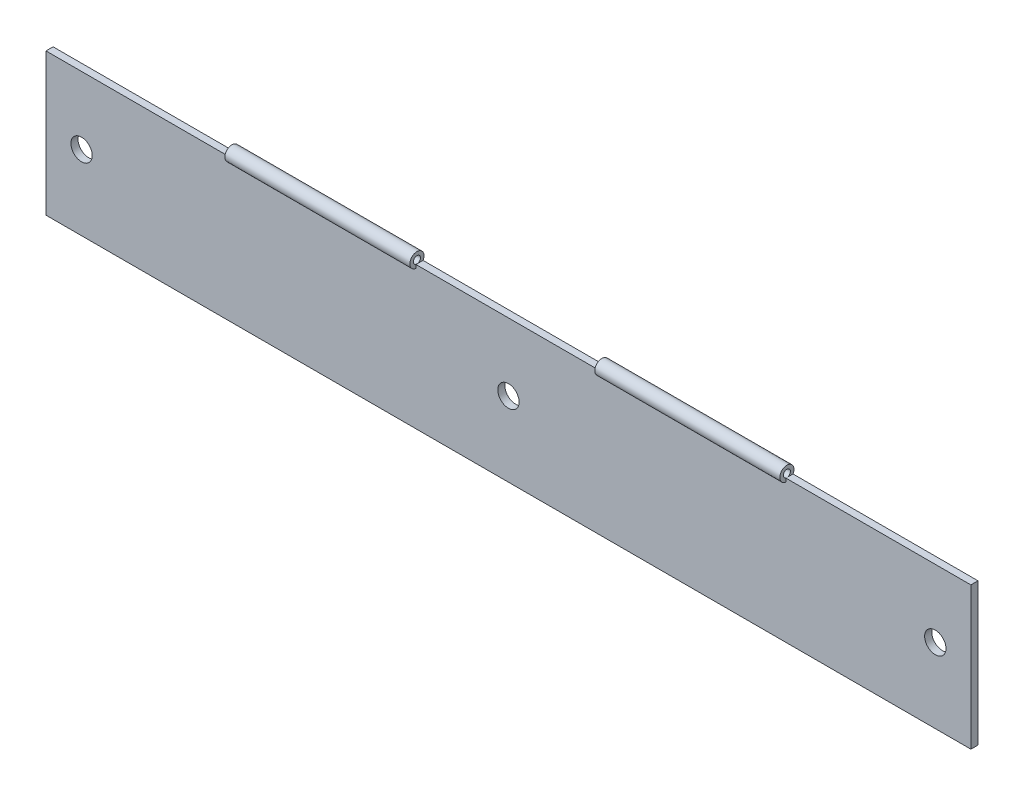
ISO-10303-21;
HEADER;
FILE_DESCRIPTION(('STEP AP214'),'2;1');
FILE_NAME('part.step','',(''),(''),'','','');
FILE_SCHEMA(('AUTOMOTIVE_DESIGN { 1 0 10303 214 1 1 1 1 }'));
ENDSEC;
DATA;
#1=APPLICATION_CONTEXT('core data for automotive mechanical design processes');
#2=APPLICATION_PROTOCOL_DEFINITION('international standard','automotive_design',2000,#1);
#3=PRODUCT_CONTEXT('',#1,'mechanical');
#4=PRODUCT('Part','Part','',(#3));
#5=PRODUCT_RELATED_PRODUCT_CATEGORY('part','',(#4));
#6=PRODUCT_DEFINITION_FORMATION('','',#4);
#7=PRODUCT_DEFINITION_CONTEXT('part definition',#1,'design');
#8=PRODUCT_DEFINITION('design','',#6,#7);
#9=PRODUCT_DEFINITION_SHAPE('','',#8);
#10=(LENGTH_UNIT() NAMED_UNIT(*) SI_UNIT(.MILLI.,.METRE.));
#11=(NAMED_UNIT(*) PLANE_ANGLE_UNIT() SI_UNIT($,.RADIAN.));
#12=(NAMED_UNIT(*) SI_UNIT($,.STERADIAN.) SOLID_ANGLE_UNIT());
#13=UNCERTAINTY_MEASURE_WITH_UNIT(LENGTH_MEASURE(1.E-05),#10,'distance_accuracy_value','');
#14=(GEOMETRIC_REPRESENTATION_CONTEXT(3) GLOBAL_UNCERTAINTY_ASSIGNED_CONTEXT((#13)) GLOBAL_UNIT_ASSIGNED_CONTEXT((#10,
#11,#12)) REPRESENTATION_CONTEXT('',''));
#15=CARTESIAN_POINT('',(0.,0.,0.));
#16=DIRECTION('',(0.,0.,1.));
#17=DIRECTION('',(1.,0.,0.));
#18=AXIS2_PLACEMENT_3D('',#15,#16,#17);
#19=CARTESIAN_POINT('',(0.,20.,1.));
#20=DIRECTION('',(0.,-1.,0.));
#21=DIRECTION('',(0.,0.,-1.));
#22=AXIS2_PLACEMENT_3D('',#19,#20,#21);
#23=PLANE('',#22);
#24=DIRECTION('',(0.,0.,1.));
#25=VECTOR('',#24,1.);
#26=CARTESIAN_POINT('',(78.,20.,1.));
#27=LINE('',#26,#25);
#28=CARTESIAN_POINT('',(78.,20.,0.));
#29=VERTEX_POINT('',#28);
#30=CARTESIAN_POINT('',(78.,20.,1.));
#31=VERTEX_POINT('',#30);
#32=EDGE_CURVE('E40',#29,#31,#27,.T.);
#33=ORIENTED_EDGE('',*,*,#32,.F.);
#34=DIRECTION('',(-1.,0.,0.));
#35=VECTOR('',#34,1.);
#36=CARTESIAN_POINT('',(0.,20.,0.));
#37=LINE('',#36,#35);
#38=CARTESIAN_POINT('',(52.,20.,0.));
#39=VERTEX_POINT('',#38);
#40=EDGE_CURVE('E106',#29,#39,#37,.T.);
#41=ORIENTED_EDGE('',*,*,#40,.T.);
#42=DIRECTION('',(0.,0.,1.));
#43=VECTOR('',#42,1.);
#44=CARTESIAN_POINT('',(52.,20.,1.));
#45=LINE('',#44,#43);
#46=CARTESIAN_POINT('',(52.,20.,1.));
#47=VERTEX_POINT('',#46);
#48=EDGE_CURVE('E127',#39,#47,#45,.T.);
#49=ORIENTED_EDGE('',*,*,#48,.T.);
#50=DIRECTION('',(-1.,0.,0.));
#51=VECTOR('',#50,1.);
#52=CARTESIAN_POINT('',(0.,20.,1.));
#53=LINE('',#52,#51);
#54=EDGE_CURVE('E124',#31,#47,#53,.T.);
#55=ORIENTED_EDGE('',*,*,#54,.F.);
#56=EDGE_LOOP('',(#33,#41,#49,#55));
#57=FACE_BOUND('',#56,.T.);
#58=ADVANCED_FACE('F32',(#57),#23,.F.);
#59=DIRECTION('',(0.,0.,1.));
#60=VECTOR('',#59,1.);
#61=CARTESIAN_POINT('',(26.,20.,1.));
#62=LINE('',#61,#60);
#63=CARTESIAN_POINT('',(26.,20.,0.));
#64=VERTEX_POINT('',#63);
#65=CARTESIAN_POINT('',(26.,20.,1.));
#66=VERTEX_POINT('',#65);
#67=EDGE_CURVE('E216',#64,#66,#62,.T.);
#68=ORIENTED_EDGE('',*,*,#67,.F.);
#69=CARTESIAN_POINT('',(0.,20.,0.));
#70=VERTEX_POINT('',#69);
#71=EDGE_CURVE('E135',#64,#70,#37,.T.);
#72=ORIENTED_EDGE('',*,*,#71,.T.);
#73=DIRECTION('',(0.,0.,-1.));
#74=VECTOR('',#73,1.);
#75=CARTESIAN_POINT('',(0.,20.,1.));
#76=LINE('',#75,#74);
#77=CARTESIAN_POINT('',(0.,20.,1.));
#78=VERTEX_POINT('',#77);
#79=EDGE_CURVE('E198',#78,#70,#76,.T.);
#80=ORIENTED_EDGE('',*,*,#79,.F.);
#81=EDGE_CURVE('E195',#66,#78,#53,.T.);
#82=ORIENTED_EDGE('',*,*,#81,.F.);
#83=EDGE_LOOP('',(#68,#72,#80,#82));
#84=FACE_BOUND('',#83,.T.);
#85=ADVANCED_FACE('F234',(#84),#23,.F.);
#86=CARTESIAN_POINT('',(0.,0.,1.));
#87=DIRECTION('',(0.,0.,-1.));
#88=DIRECTION('',(-1.,0.,0.));
#89=AXIS2_PLACEMENT_3D('',#86,#87,#88);
#90=PLANE('',#89);
#91=CARTESIAN_POINT('',(130.,20.,1.));
#92=VERTEX_POINT('',#91);
#93=CARTESIAN_POINT('',(104.,20.,1.));
#94=VERTEX_POINT('',#93);
#95=EDGE_CURVE('E196',#92,#94,#53,.T.);
#96=ORIENTED_EDGE('',*,*,#95,.T.);
#97=DIRECTION('',(0.,-1.,0.));
#98=VECTOR('',#97,1.);
#99=CARTESIAN_POINT('',(104.,0.,1.));
#100=LINE('',#99,#98);
#101=CARTESIAN_POINT('',(104.,19.5136530597757,1.));
#102=VERTEX_POINT('',#101);
#103=EDGE_CURVE('E47',#94,#102,#100,.T.);
#104=ORIENTED_EDGE('',*,*,#103,.T.);
#105=DIRECTION('',(-1.,0.,0.));
#106=VECTOR('',#105,1.);
#107=CARTESIAN_POINT('',(104.,19.5136530597757,1.));
#108=LINE('',#107,#106);
#109=CARTESIAN_POINT('',(78.,19.5136530597757,1.));
#110=VERTEX_POINT('',#109);
#111=EDGE_CURVE('E51',#110,#102,#108,.F.);
#112=ORIENTED_EDGE('',*,*,#111,.F.);
#113=DIRECTION('',(0.,-1.,0.));
#114=VECTOR('',#113,1.);
#115=CARTESIAN_POINT('',(78.,0.,1.));
#116=LINE('',#115,#114);
#117=EDGE_CURVE('E137',#31,#110,#116,.T.);
#118=ORIENTED_EDGE('',*,*,#117,.F.);
#119=ORIENTED_EDGE('',*,*,#54,.T.);
#120=DIRECTION('',(0.,-1.,0.));
#121=VECTOR('',#120,1.);
#122=CARTESIAN_POINT('',(52.,0.,1.));
#123=LINE('',#122,#121);
#124=CARTESIAN_POINT('',(52.,19.5136530597757,1.));
#125=VERTEX_POINT('',#124);
#126=EDGE_CURVE('E167',#47,#125,#123,.T.);
#127=ORIENTED_EDGE('',*,*,#126,.T.);
#128=DIRECTION('',(-1.,0.,0.));
#129=VECTOR('',#128,1.);
#130=CARTESIAN_POINT('',(52.,19.5136530597757,1.));
#131=LINE('',#130,#129);
#132=CARTESIAN_POINT('',(26.,19.5136530597757,1.));
#133=VERTEX_POINT('',#132);
#134=EDGE_CURVE('E159',#133,#125,#131,.F.);
#135=ORIENTED_EDGE('',*,*,#134,.F.);
#136=DIRECTION('',(0.,-1.,0.));
#137=VECTOR('',#136,1.);
#138=CARTESIAN_POINT('',(26.,0.,1.));
#139=LINE('',#138,#137);
#140=EDGE_CURVE('E164',#66,#133,#139,.T.);
#141=ORIENTED_EDGE('',*,*,#140,.F.);
#142=ORIENTED_EDGE('',*,*,#81,.T.);
#143=DIRECTION('',(0.,-1.,0.));
#144=VECTOR('',#143,1.);
#145=CARTESIAN_POINT('',(0.,0.,1.));
#146=LINE('',#145,#144);
#147=CARTESIAN_POINT('',(0.,0.,1.));
#148=VERTEX_POINT('',#147);
#149=EDGE_CURVE('E188',#78,#148,#146,.T.);
#150=ORIENTED_EDGE('',*,*,#149,.T.);
#151=DIRECTION('',(1.,0.,0.));
#152=VECTOR('',#151,1.);
#153=CARTESIAN_POINT('',(0.,0.,1.));
#154=LINE('',#153,#152);
#155=CARTESIAN_POINT('',(130.,0.,1.));
#156=VERTEX_POINT('',#155);
#157=EDGE_CURVE('E191',#148,#156,#154,.T.);
#158=ORIENTED_EDGE('',*,*,#157,.T.);
#159=DIRECTION('',(0.,1.,0.));
#160=VECTOR('',#159,1.);
#161=CARTESIAN_POINT('',(130.,0.,1.));
#162=LINE('',#161,#160);
#163=EDGE_CURVE('E193',#156,#92,#162,.T.);
#164=ORIENTED_EDGE('',*,*,#163,.T.);
#165=EDGE_LOOP('',(#96,#104,#112,#118,#119,#127,#135,#141,#142,#150,#158,#164));
#166=FACE_BOUND('',#165,.T.);
#167=CARTESIAN_POINT('',(65.,10.5,1.));
#168=DIRECTION('',(0.,0.,1.));
#169=DIRECTION('',(1.,0.,0.));
#170=AXIS2_PLACEMENT_3D('',#167,#168,#169);
#171=CIRCLE('',#170,1.5);
#172=CARTESIAN_POINT('',(66.5,10.5,1.));
#173=VERTEX_POINT('',#172);
#174=EDGE_CURVE('E182',#173,#173,#171,.T.);
#175=ORIENTED_EDGE('',*,*,#174,.F.);
#176=EDGE_LOOP('',(#175));
#177=FACE_BOUND('',#176,.T.);
#178=CARTESIAN_POINT('',(5.,10.5,1.));
#179=DIRECTION('',(0.,0.,1.));
#180=DIRECTION('',(1.,0.,0.));
#181=AXIS2_PLACEMENT_3D('',#178,#179,#180);
#182=CIRCLE('',#181,1.5);
#183=CARTESIAN_POINT('',(6.50000000000001,10.5,1.));
#184=VERTEX_POINT('',#183);
#185=EDGE_CURVE('E176',#184,#184,#182,.T.);
#186=ORIENTED_EDGE('',*,*,#185,.F.);
#187=EDGE_LOOP('',(#186));
#188=FACE_BOUND('',#187,.T.);
#189=CARTESIAN_POINT('',(125.,10.5,1.));
#190=DIRECTION('',(0.,0.,1.));
#191=DIRECTION('',(1.,0.,0.));
#192=AXIS2_PLACEMENT_3D('',#189,#190,#191);
#193=CIRCLE('',#192,1.5);
#194=CARTESIAN_POINT('',(126.5,10.5,1.));
#195=VERTEX_POINT('',#194);
#196=EDGE_CURVE('E170',#195,#195,#193,.T.);
#197=ORIENTED_EDGE('',*,*,#196,.F.);
#198=EDGE_LOOP('',(#197));
#199=FACE_BOUND('',#198,.T.);
#200=ADVANCED_FACE('F223',(#166,#177,#188,#199),#90,.F.);
#201=CARTESIAN_POINT('',(0.,0.,0.));
#202=DIRECTION('',(0.,0.,-1.));
#203=DIRECTION('',(-1.,0.,0.));
#204=AXIS2_PLACEMENT_3D('',#201,#202,#203);
#205=PLANE('',#204);
#206=CARTESIAN_POINT('',(5.,10.5,0.));
#207=DIRECTION('',(0.,0.,1.));
#208=DIRECTION('',(1.,0.,0.));
#209=AXIS2_PLACEMENT_3D('',#206,#207,#208);
#210=CIRCLE('',#209,1.5);
#211=CARTESIAN_POINT('',(6.50000000000001,10.5,0.));
#212=VERTEX_POINT('',#211);
#213=EDGE_CURVE('E173',#212,#212,#210,.T.);
#214=ORIENTED_EDGE('',*,*,#213,.T.);
#215=EDGE_LOOP('',(#214));
#216=FACE_BOUND('',#215,.T.);
#217=DIRECTION('',(0.,-1.,0.));
#218=VECTOR('',#217,1.);
#219=CARTESIAN_POINT('',(0.,0.,0.));
#220=LINE('',#219,#218);
#221=CARTESIAN_POINT('',(0.,0.,0.));
#222=VERTEX_POINT('',#221);
#223=EDGE_CURVE('E185',#70,#222,#220,.T.);
#224=ORIENTED_EDGE('',*,*,#223,.F.);
#225=ORIENTED_EDGE('',*,*,#71,.F.);
#226=EDGE_CURVE('E116',#39,#64,#37,.T.);
#227=ORIENTED_EDGE('',*,*,#226,.F.);
#228=ORIENTED_EDGE('',*,*,#40,.F.);
#229=CARTESIAN_POINT('',(104.,20.,0.));
#230=VERTEX_POINT('',#229);
#231=EDGE_CURVE('E113',#230,#29,#37,.T.);
#232=ORIENTED_EDGE('',*,*,#231,.F.);
#233=CARTESIAN_POINT('',(130.,20.,0.));
#234=VERTEX_POINT('',#233);
#235=EDGE_CURVE('E121',#234,#230,#37,.T.);
#236=ORIENTED_EDGE('',*,*,#235,.F.);
#237=DIRECTION('',(0.,1.,0.));
#238=VECTOR('',#237,1.);
#239=CARTESIAN_POINT('',(130.,0.,0.));
#240=LINE('',#239,#238);
#241=CARTESIAN_POINT('',(130.,0.,0.));
#242=VERTEX_POINT('',#241);
#243=EDGE_CURVE('E203',#242,#234,#240,.T.);
#244=ORIENTED_EDGE('',*,*,#243,.F.);
#245=DIRECTION('',(1.,0.,0.));
#246=VECTOR('',#245,1.);
#247=CARTESIAN_POINT('',(0.,0.,0.));
#248=LINE('',#247,#246);
#249=EDGE_CURVE('E201',#222,#242,#248,.T.);
#250=ORIENTED_EDGE('',*,*,#249,.F.);
#251=EDGE_LOOP('',(#224,#225,#227,#228,#232,#236,#244,#250));
#252=FACE_BOUND('',#251,.T.);
#253=CARTESIAN_POINT('',(65.,10.5,0.));
#254=DIRECTION('',(0.,0.,1.));
#255=DIRECTION('',(1.,0.,0.));
#256=AXIS2_PLACEMENT_3D('',#253,#254,#255);
#257=CIRCLE('',#256,1.5);
#258=CARTESIAN_POINT('',(66.5,10.5,0.));
#259=VERTEX_POINT('',#258);
#260=EDGE_CURVE('E179',#259,#259,#257,.T.);
#261=ORIENTED_EDGE('',*,*,#260,.T.);
#262=EDGE_LOOP('',(#261));
#263=FACE_BOUND('',#262,.T.);
#264=CARTESIAN_POINT('',(125.,10.5,0.));
#265=DIRECTION('',(0.,0.,1.));
#266=DIRECTION('',(1.,0.,0.));
#267=AXIS2_PLACEMENT_3D('',#264,#265,#266);
#268=CIRCLE('',#267,1.5);
#269=CARTESIAN_POINT('',(126.5,10.5,0.));
#270=VERTEX_POINT('',#269);
#271=EDGE_CURVE('E169',#270,#270,#268,.T.);
#272=ORIENTED_EDGE('',*,*,#271,.T.);
#273=EDGE_LOOP('',(#272));
#274=FACE_BOUND('',#273,.T.);
#275=ADVANCED_FACE('F109',(#216,#252,#263,#274),#205,.T.);
#276=CARTESIAN_POINT('',(0.,0.,1.));
#277=DIRECTION('',(1.,0.,0.));
#278=DIRECTION('',(0.,0.,-1.));
#279=AXIS2_PLACEMENT_3D('',#276,#277,#278);
#280=PLANE('',#279);
#281=ORIENTED_EDGE('',*,*,#223,.T.);
#282=DIRECTION('',(0.,0.,-1.));
#283=VECTOR('',#282,1.);
#284=CARTESIAN_POINT('',(0.,0.,1.));
#285=LINE('',#284,#283);
#286=EDGE_CURVE('E213',#148,#222,#285,.T.);
#287=ORIENTED_EDGE('',*,*,#286,.F.);
#288=ORIENTED_EDGE('',*,*,#149,.F.);
#289=ORIENTED_EDGE('',*,*,#79,.T.);
#290=EDGE_LOOP('',(#281,#287,#288,#289));
#291=FACE_BOUND('',#290,.T.);
#292=ADVANCED_FACE('F34',(#291),#280,.F.);
#293=CARTESIAN_POINT('',(0.,0.,1.));
#294=DIRECTION('',(0.,1.,0.));
#295=DIRECTION('',(0.,0.,1.));
#296=AXIS2_PLACEMENT_3D('',#293,#294,#295);
#297=PLANE('',#296);
#298=ORIENTED_EDGE('',*,*,#249,.T.);
#299=DIRECTION('',(0.,0.,-1.));
#300=VECTOR('',#299,1.);
#301=CARTESIAN_POINT('',(130.,0.,1.));
#302=LINE('',#301,#300);
#303=EDGE_CURVE('E210',#156,#242,#302,.T.);
#304=ORIENTED_EDGE('',*,*,#303,.F.);
#305=ORIENTED_EDGE('',*,*,#157,.F.);
#306=ORIENTED_EDGE('',*,*,#286,.T.);
#307=EDGE_LOOP('',(#298,#304,#305,#306));
#308=FACE_BOUND('',#307,.T.);
#309=ADVANCED_FACE('F242',(#308),#297,.F.);
#310=CARTESIAN_POINT('',(130.,0.,1.));
#311=DIRECTION('',(-1.,0.,0.));
#312=DIRECTION('',(0.,0.,1.));
#313=AXIS2_PLACEMENT_3D('',#310,#311,#312);
#314=PLANE('',#313);
#315=ORIENTED_EDGE('',*,*,#243,.T.);
#316=DIRECTION('',(0.,0.,-1.));
#317=VECTOR('',#316,1.);
#318=CARTESIAN_POINT('',(130.,20.,1.));
#319=LINE('',#318,#317);
#320=EDGE_CURVE('E207',#92,#234,#319,.T.);
#321=ORIENTED_EDGE('',*,*,#320,.F.);
#322=ORIENTED_EDGE('',*,*,#163,.F.);
#323=ORIENTED_EDGE('',*,*,#303,.T.);
#324=EDGE_LOOP('',(#315,#321,#322,#323));
#325=FACE_BOUND('',#324,.T.);
#326=ADVANCED_FACE('F245',(#325),#314,.F.);
#327=ORIENTED_EDGE('',*,*,#235,.T.);
#328=DIRECTION('',(0.,0.,1.));
#329=VECTOR('',#328,1.);
#330=CARTESIAN_POINT('',(104.,20.,1.));
#331=LINE('',#330,#329);
#332=EDGE_CURVE('E11',#230,#94,#331,.T.);
#333=ORIENTED_EDGE('',*,*,#332,.T.);
#334=ORIENTED_EDGE('',*,*,#95,.F.);
#335=ORIENTED_EDGE('',*,*,#320,.T.);
#336=EDGE_LOOP('',(#327,#333,#334,#335));
#337=FACE_BOUND('',#336,.T.);
#338=ADVANCED_FACE('F248',(#337),#23,.F.);
#339=CARTESIAN_POINT('',(65.,10.5,1.));
#340=DIRECTION('',(0.,0.,-1.));
#341=DIRECTION('',(-1.,0.,0.));
#342=AXIS2_PLACEMENT_3D('',#339,#340,#341);
#343=CYLINDRICAL_SURFACE('',#342,1.5);
#344=ORIENTED_EDGE('',*,*,#174,.T.);
#345=EDGE_LOOP('',(#344));
#346=FACE_BOUND('',#345,.T.);
#347=ORIENTED_EDGE('',*,*,#260,.F.);
#348=EDGE_LOOP('',(#347));
#349=FACE_BOUND('',#348,.T.);
#350=ADVANCED_FACE('F274',(#346,#349),#343,.F.);
#351=CARTESIAN_POINT('',(5.,10.5,1.));
#352=DIRECTION('',(0.,0.,-1.));
#353=DIRECTION('',(-1.,0.,0.));
#354=AXIS2_PLACEMENT_3D('',#351,#352,#353);
#355=CYLINDRICAL_SURFACE('',#354,1.5);
#356=ORIENTED_EDGE('',*,*,#185,.T.);
#357=EDGE_LOOP('',(#356));
#358=FACE_BOUND('',#357,.T.);
#359=ORIENTED_EDGE('',*,*,#213,.F.);
#360=EDGE_LOOP('',(#359));
#361=FACE_BOUND('',#360,.T.);
#362=ADVANCED_FACE('F279',(#358,#361),#355,.F.);
#363=CARTESIAN_POINT('',(125.,10.5,1.));
#364=DIRECTION('',(0.,0.,-1.));
#365=DIRECTION('',(-1.,0.,0.));
#366=AXIS2_PLACEMENT_3D('',#363,#364,#365);
#367=CYLINDRICAL_SURFACE('',#366,1.5);
#368=ORIENTED_EDGE('',*,*,#196,.T.);
#369=EDGE_LOOP('',(#368));
#370=FACE_BOUND('',#369,.T.);
#371=ORIENTED_EDGE('',*,*,#271,.F.);
#372=EDGE_LOOP('',(#371));
#373=FACE_BOUND('',#372,.T.);
#374=ADVANCED_FACE('F299',(#370,#373),#367,.F.);
#375=CARTESIAN_POINT('',(52.,20.5042972792787,0.863530111873398));
#376=DIRECTION('',(1.,0.,0.));
#377=DIRECTION('',(0.,0.,-1.));
#378=AXIS2_PLACEMENT_3D('',#375,#376,#377);
#379=PLANE('',#378);
#380=CARTESIAN_POINT('',(52.,20.5042972792787,0.863530111873398));
#381=DIRECTION('',(1.,0.,0.));
#382=DIRECTION('',(0.,0.,-1.));
#383=AXIS2_PLACEMENT_3D('',#380,#381,#382);
#384=CIRCLE('',#383,0.500000000000001);
#385=CARTESIAN_POINT('',(52.,20.5042972792787,0.363530111873397));
#386=VERTEX_POINT('',#385);
#387=EDGE_CURVE('E150',#386,#386,#384,.T.);
#388=ORIENTED_EDGE('',*,*,#387,.F.);
#389=EDGE_LOOP('',(#388));
#390=FACE_BOUND('',#389,.T.);
#391=ORIENTED_EDGE('',*,*,#126,.F.);
#392=ORIENTED_EDGE('',*,*,#48,.F.);
#393=CARTESIAN_POINT('',(52.,20.5042972792787,0.863530111873398));
#394=DIRECTION('',(1.,0.,0.));
#395=DIRECTION('',(0.,0.,-1.));
#396=AXIS2_PLACEMENT_3D('',#393,#394,#395);
#397=CIRCLE('',#396,1.);
#398=EDGE_CURVE('E156',#39,#125,#397,.T.);
#399=ORIENTED_EDGE('',*,*,#398,.T.);
#400=EDGE_LOOP('',(#391,#392,#399));
#401=FACE_BOUND('',#400,.T.);
#402=ADVANCED_FACE('F222',(#390,#401),#379,.T.);
#403=CARTESIAN_POINT('',(26.,20.5042972792787,0.863530111873398));
#404=DIRECTION('',(1.,0.,0.));
#405=DIRECTION('',(0.,0.,-1.));
#406=AXIS2_PLACEMENT_3D('',#403,#404,#405);
#407=PLANE('',#406);
#408=CARTESIAN_POINT('',(26.,20.5042972792787,0.863530111873398));
#409=DIRECTION('',(1.,0.,0.));
#410=DIRECTION('',(0.,0.,-1.));
#411=AXIS2_PLACEMENT_3D('',#408,#409,#410);
#412=CIRCLE('',#411,0.500000000000001);
#413=CARTESIAN_POINT('',(26.,20.5042972792787,0.363530111873397));
#414=VERTEX_POINT('',#413);
#415=EDGE_CURVE('E149',#414,#414,#412,.T.);
#416=ORIENTED_EDGE('',*,*,#415,.T.);
#417=EDGE_LOOP('',(#416));
#418=FACE_BOUND('',#417,.T.);
#419=ORIENTED_EDGE('',*,*,#67,.T.);
#420=ORIENTED_EDGE('',*,*,#140,.T.);
#421=CARTESIAN_POINT('',(26.,20.5042972792787,0.863530111873398));
#422=DIRECTION('',(1.,0.,0.));
#423=DIRECTION('',(0.,0.,-1.));
#424=AXIS2_PLACEMENT_3D('',#421,#422,#423);
#425=CIRCLE('',#424,1.);
#426=EDGE_CURVE('E153',#64,#133,#425,.T.);
#427=ORIENTED_EDGE('',*,*,#426,.F.);
#428=EDGE_LOOP('',(#419,#420,#427));
#429=FACE_BOUND('',#428,.T.);
#430=ADVANCED_FACE('F229',(#418,#429),#407,.F.);
#431=CARTESIAN_POINT('',(52.,20.5042972792787,0.863530111873398));
#432=DIRECTION('',(-1.,0.,0.));
#433=DIRECTION('',(0.,0.,1.));
#434=AXIS2_PLACEMENT_3D('',#431,#432,#433);
#435=CYLINDRICAL_SURFACE('',#434,1.);
#436=ORIENTED_EDGE('',*,*,#426,.T.);
#437=ORIENTED_EDGE('',*,*,#134,.T.);
#438=ORIENTED_EDGE('',*,*,#398,.F.);
#439=ORIENTED_EDGE('',*,*,#226,.T.);
#440=EDGE_LOOP('',(#436,#437,#438,#439));
#441=FACE_BOUND('',#440,.T.);
#442=ADVANCED_FACE('F226',(#441),#435,.T.);
#443=CARTESIAN_POINT('',(52.,20.5042972792787,0.863530111873398));
#444=DIRECTION('',(-1.,0.,0.));
#445=DIRECTION('',(0.,0.,1.));
#446=AXIS2_PLACEMENT_3D('',#443,#444,#445);
#447=CYLINDRICAL_SURFACE('',#446,0.500000000000001);
#448=ORIENTED_EDGE('',*,*,#387,.T.);
#449=EDGE_LOOP('',(#448));
#450=FACE_BOUND('',#449,.T.);
#451=ORIENTED_EDGE('',*,*,#415,.F.);
#452=EDGE_LOOP('',(#451));
#453=FACE_BOUND('',#452,.T.);
#454=ADVANCED_FACE('F253',(#450,#453),#447,.F.);
#455=CARTESIAN_POINT('',(104.,20.5042972792787,0.863530111873398));
#456=DIRECTION('',(1.,0.,0.));
#457=DIRECTION('',(0.,0.,-1.));
#458=AXIS2_PLACEMENT_3D('',#455,#456,#457);
#459=PLANE('',#458);
#460=CARTESIAN_POINT('',(104.,20.5042972792787,0.863530111873398));
#461=DIRECTION('',(1.,0.,0.));
#462=DIRECTION('',(0.,0.,-1.));
#463=AXIS2_PLACEMENT_3D('',#460,#461,#462);
#464=CIRCLE('',#463,0.500000000000001);
#465=CARTESIAN_POINT('',(104.,20.5042972792787,0.363530111873397));
#466=VERTEX_POINT('',#465);
#467=EDGE_CURVE('E138',#466,#466,#464,.T.);
#468=ORIENTED_EDGE('',*,*,#467,.F.);
#469=EDGE_LOOP('',(#468));
#470=FACE_BOUND('',#469,.T.);
#471=ORIENTED_EDGE('',*,*,#103,.F.);
#472=ORIENTED_EDGE('',*,*,#332,.F.);
#473=CARTESIAN_POINT('',(104.,20.5042972792787,0.863530111873398));
#474=DIRECTION('',(1.,0.,0.));
#475=DIRECTION('',(0.,0.,-1.));
#476=AXIS2_PLACEMENT_3D('',#473,#474,#475);
#477=CIRCLE('',#476,1.);
#478=EDGE_CURVE('E134',#230,#102,#477,.T.);
#479=ORIENTED_EDGE('',*,*,#478,.T.);
#480=EDGE_LOOP('',(#471,#472,#479));
#481=FACE_BOUND('',#480,.T.);
#482=ADVANCED_FACE('F251',(#470,#481),#459,.T.);
#483=CARTESIAN_POINT('',(78.,20.5042972792787,0.863530111873398));
#484=DIRECTION('',(1.,0.,0.));
#485=DIRECTION('',(0.,0.,-1.));
#486=AXIS2_PLACEMENT_3D('',#483,#484,#485);
#487=PLANE('',#486);
#488=CARTESIAN_POINT('',(78.,20.5042972792787,0.863530111873398));
#489=DIRECTION('',(1.,0.,0.));
#490=DIRECTION('',(0.,0.,-1.));
#491=AXIS2_PLACEMENT_3D('',#488,#489,#490);
#492=CIRCLE('',#491,0.500000000000001);
#493=CARTESIAN_POINT('',(78.,20.5042972792787,0.363530111873397));
#494=VERTEX_POINT('',#493);
#495=EDGE_CURVE('E142',#494,#494,#492,.T.);
#496=ORIENTED_EDGE('',*,*,#495,.T.);
#497=EDGE_LOOP('',(#496));
#498=FACE_BOUND('',#497,.T.);
#499=ORIENTED_EDGE('',*,*,#32,.T.);
#500=ORIENTED_EDGE('',*,*,#117,.T.);
#501=CARTESIAN_POINT('',(78.,20.5042972792787,0.863530111873398));
#502=DIRECTION('',(1.,0.,0.));
#503=DIRECTION('',(0.,0.,-1.));
#504=AXIS2_PLACEMENT_3D('',#501,#502,#503);
#505=CIRCLE('',#504,1.);
#506=EDGE_CURVE('E132',#29,#110,#505,.T.);
#507=ORIENTED_EDGE('',*,*,#506,.F.);
#508=EDGE_LOOP('',(#499,#500,#507));
#509=FACE_BOUND('',#508,.T.);
#510=ADVANCED_FACE('F136',(#498,#509),#487,.F.);
#511=CARTESIAN_POINT('',(104.,20.5042972792787,0.863530111873398));
#512=DIRECTION('',(-1.,0.,0.));
#513=DIRECTION('',(0.,0.,1.));
#514=AXIS2_PLACEMENT_3D('',#511,#512,#513);
#515=CYLINDRICAL_SURFACE('',#514,1.);
#516=ORIENTED_EDGE('',*,*,#506,.T.);
#517=ORIENTED_EDGE('',*,*,#111,.T.);
#518=ORIENTED_EDGE('',*,*,#478,.F.);
#519=ORIENTED_EDGE('',*,*,#231,.T.);
#520=EDGE_LOOP('',(#516,#517,#518,#519));
#521=FACE_BOUND('',#520,.T.);
#522=ADVANCED_FACE('F131',(#521),#515,.T.);
#523=CARTESIAN_POINT('',(104.,20.5042972792787,0.863530111873398));
#524=DIRECTION('',(-1.,0.,0.));
#525=DIRECTION('',(0.,0.,1.));
#526=AXIS2_PLACEMENT_3D('',#523,#524,#525);
#527=CYLINDRICAL_SURFACE('',#526,0.500000000000001);
#528=ORIENTED_EDGE('',*,*,#467,.T.);
#529=EDGE_LOOP('',(#528));
#530=FACE_BOUND('',#529,.T.);
#531=ORIENTED_EDGE('',*,*,#495,.F.);
#532=EDGE_LOOP('',(#531));
#533=FACE_BOUND('',#532,.T.);
#534=ADVANCED_FACE('F313',(#530,#533),#527,.F.);
#535=CLOSED_SHELL('',(#58,#85,#200,#275,#292,#309,#326,#338,#350,#362,#374,#402,#430,#442,#454,
#482,#510,#522,#534));
#536=MANIFOLD_SOLID_BREP('B2',#535);
#537=ADVANCED_BREP_SHAPE_REPRESENTATION('',(#18,#536),#14);
#538=SHAPE_DEFINITION_REPRESENTATION(#9,#537);
ENDSEC;
END-ISO-10303-21;
